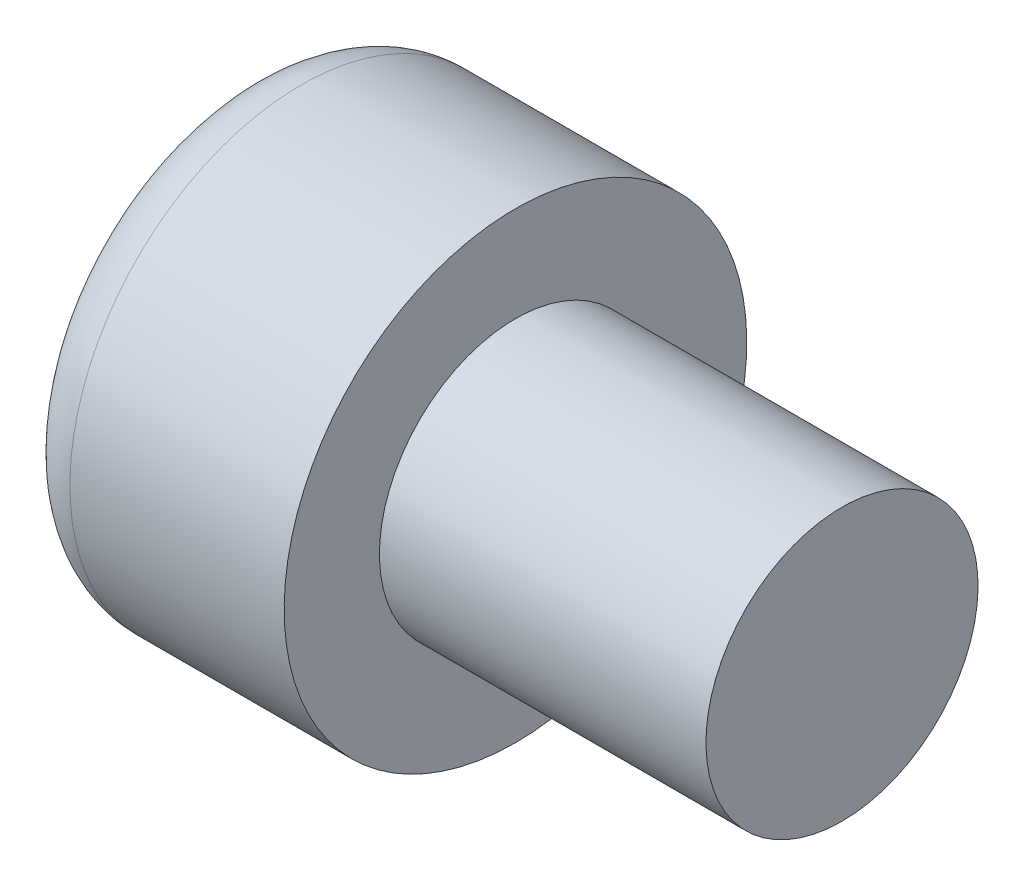
ISO-10303-21;
HEADER;
FILE_DESCRIPTION(('STEP AP214'),'2;1');
FILE_NAME('part.step','',(''),(''),'','','');
FILE_SCHEMA(('AUTOMOTIVE_DESIGN { 1 0 10303 214 1 1 1 1 }'));
ENDSEC;
DATA;
#1=APPLICATION_CONTEXT('core data for automotive mechanical design processes');
#2=APPLICATION_PROTOCOL_DEFINITION('international standard','automotive_design',2000,#1);
#3=PRODUCT_CONTEXT('',#1,'mechanical');
#4=PRODUCT('Part','Part','',(#3));
#5=PRODUCT_RELATED_PRODUCT_CATEGORY('part','',(#4));
#6=PRODUCT_DEFINITION_FORMATION('','',#4);
#7=PRODUCT_DEFINITION_CONTEXT('part definition',#1,'design');
#8=PRODUCT_DEFINITION('design','',#6,#7);
#9=PRODUCT_DEFINITION_SHAPE('','',#8);
#10=(LENGTH_UNIT() NAMED_UNIT(*) SI_UNIT(.MILLI.,.METRE.));
#11=(NAMED_UNIT(*) PLANE_ANGLE_UNIT() SI_UNIT($,.RADIAN.));
#12=(NAMED_UNIT(*) SI_UNIT($,.STERADIAN.) SOLID_ANGLE_UNIT());
#13=UNCERTAINTY_MEASURE_WITH_UNIT(LENGTH_MEASURE(1.E-05),#10,'distance_accuracy_value','');
#14=(GEOMETRIC_REPRESENTATION_CONTEXT(3) GLOBAL_UNCERTAINTY_ASSIGNED_CONTEXT((#13)) GLOBAL_UNIT_ASSIGNED_CONTEXT((#10,
#11,#12)) REPRESENTATION_CONTEXT('',''));
#15=CARTESIAN_POINT('',(0.,0.,0.));
#16=DIRECTION('',(0.,0.,1.));
#17=DIRECTION('',(1.,0.,0.));
#18=AXIS2_PLACEMENT_3D('',#15,#16,#17);
#19=CARTESIAN_POINT('',(0.,0.,0.));
#20=DIRECTION('',(1.,0.,0.));
#21=DIRECTION('',(0.,1.,0.));
#22=AXIS2_PLACEMENT_3D('',#19,#20,#21);
#23=PLANE('',#22);
#24=DIRECTION('',(0.,-0.5,-0.866025403784439));
#25=VECTOR('',#24,1.);
#26=CARTESIAN_POINT('',(0.,2.3094010767585,0.));
#27=LINE('',#26,#25);
#28=CARTESIAN_POINT('',(0.,2.3094010767585,0.));
#29=VERTEX_POINT('',#28);
#30=CARTESIAN_POINT('',(0.,1.15470053837925,-2.));
#31=VERTEX_POINT('',#30);
#32=EDGE_CURVE('E121',#29,#31,#27,.T.);
#33=ORIENTED_EDGE('',*,*,#32,.F.);
#34=DIRECTION('',(0.,0.5,-0.866025403784439));
#35=VECTOR('',#34,1.);
#36=CARTESIAN_POINT('',(0.,1.15470053837925,2.));
#37=LINE('',#36,#35);
#38=CARTESIAN_POINT('',(0.,1.15470053837925,2.));
#39=VERTEX_POINT('',#38);
#40=EDGE_CURVE('E47',#39,#29,#37,.T.);
#41=ORIENTED_EDGE('',*,*,#40,.F.);
#42=DIRECTION('',(0.,1.,0.));
#43=VECTOR('',#42,1.);
#44=CARTESIAN_POINT('',(0.,-1.15470053837925,2.));
#45=LINE('',#44,#43);
#46=CARTESIAN_POINT('',(0.,-1.15470053837925,2.));
#47=VERTEX_POINT('',#46);
#48=EDGE_CURVE('E130',#47,#39,#45,.T.);
#49=ORIENTED_EDGE('',*,*,#48,.F.);
#50=DIRECTION('',(0.,0.5,0.866025403784439));
#51=VECTOR('',#50,1.);
#52=CARTESIAN_POINT('',(0.,-2.3094010767585,0.));
#53=LINE('',#52,#51);
#54=CARTESIAN_POINT('',(0.,-2.3094010767585,0.));
#55=VERTEX_POINT('',#54);
#56=EDGE_CURVE('E128',#55,#47,#53,.T.);
#57=ORIENTED_EDGE('',*,*,#56,.F.);
#58=DIRECTION('',(0.,-0.5,0.866025403784439));
#59=VECTOR('',#58,1.);
#60=CARTESIAN_POINT('',(0.,-1.15470053837925,-2.));
#61=LINE('',#60,#59);
#62=CARTESIAN_POINT('',(0.,-1.15470053837925,-2.));
#63=VERTEX_POINT('',#62);
#64=EDGE_CURVE('E95',#63,#55,#61,.T.);
#65=ORIENTED_EDGE('',*,*,#64,.F.);
#66=DIRECTION('',(0.,-1.,0.));
#67=VECTOR('',#66,1.);
#68=CARTESIAN_POINT('',(0.,1.15470053837925,-2.));
#69=LINE('',#68,#67);
#70=EDGE_CURVE('E124',#31,#63,#69,.T.);
#71=ORIENTED_EDGE('',*,*,#70,.F.);
#72=EDGE_LOOP('',(#33,#41,#49,#57,#65,#71));
#73=FACE_BOUND('',#72,.T.);
#74=CARTESIAN_POINT('',(0.,0.,0.));
#75=DIRECTION('',(-1.,0.,0.));
#76=DIRECTION('',(0.,-1.,0.));
#77=AXIS2_PLACEMENT_3D('',#74,#75,#76);
#78=CIRCLE('',#77,3.1875);
#79=CARTESIAN_POINT('',(0.,-3.1875,0.));
#80=VERTEX_POINT('',#79);
#81=EDGE_CURVE('E11',#80,#80,#78,.T.);
#82=ORIENTED_EDGE('',*,*,#81,.T.);
#83=EDGE_LOOP('',(#82));
#84=FACE_BOUND('',#83,.T.);
#85=ADVANCED_FACE('F33',(#73,#84),#23,.F.);
#86=CARTESIAN_POINT('',(1.0625,0.,0.));
#87=DIRECTION('',(-1.,0.,0.));
#88=DIRECTION('',(0.,-1.,0.));
#89=AXIS2_PLACEMENT_3D('',#86,#87,#88);
#90=TOROIDAL_SURFACE('',#89,3.1875,1.0625);
#91=ORIENTED_EDGE('',*,*,#81,.F.);
#92=EDGE_LOOP('',(#91));
#93=FACE_BOUND('',#92,.T.);
#94=CARTESIAN_POINT('',(1.0625,0.,0.));
#95=DIRECTION('',(-1.,0.,0.));
#96=DIRECTION('',(0.,-1.,0.));
#97=AXIS2_PLACEMENT_3D('',#94,#95,#96);
#98=CIRCLE('',#97,4.25);
#99=CARTESIAN_POINT('',(1.0625,-4.25,0.));
#100=VERTEX_POINT('',#99);
#101=EDGE_CURVE('E40',#100,#100,#98,.T.);
#102=ORIENTED_EDGE('',*,*,#101,.T.);
#103=EDGE_LOOP('',(#102));
#104=FACE_BOUND('',#103,.T.);
#105=ADVANCED_FACE('F150',(#93,#104),#90,.T.);
#106=CARTESIAN_POINT('',(0.,0.,0.));
#107=DIRECTION('',(-1.,0.,0.));
#108=DIRECTION('',(0.,-1.,0.));
#109=AXIS2_PLACEMENT_3D('',#106,#107,#108);
#110=CYLINDRICAL_SURFACE('',#109,4.25);
#111=ORIENTED_EDGE('',*,*,#101,.F.);
#112=EDGE_LOOP('',(#111));
#113=FACE_BOUND('',#112,.T.);
#114=CARTESIAN_POINT('',(5.,0.,0.));
#115=DIRECTION('',(-1.,0.,0.));
#116=DIRECTION('',(0.,-1.,0.));
#117=AXIS2_PLACEMENT_3D('',#114,#115,#116);
#118=CIRCLE('',#117,4.25);
#119=CARTESIAN_POINT('',(5.,-4.25,0.));
#120=VERTEX_POINT('',#119);
#121=EDGE_CURVE('E145',#120,#120,#118,.T.);
#122=ORIENTED_EDGE('',*,*,#121,.T.);
#123=EDGE_LOOP('',(#122));
#124=FACE_BOUND('',#123,.T.);
#125=ADVANCED_FACE('F152',(#113,#124),#110,.T.);
#126=CARTESIAN_POINT('',(5.,4.25,0.));
#127=DIRECTION('',(-1.,0.,0.));
#128=DIRECTION('',(0.,-1.,0.));
#129=AXIS2_PLACEMENT_3D('',#126,#127,#128);
#130=PLANE('',#129);
#131=ORIENTED_EDGE('',*,*,#121,.F.);
#132=EDGE_LOOP('',(#131));
#133=FACE_BOUND('',#132,.T.);
#134=CARTESIAN_POINT('',(5.,0.,0.));
#135=DIRECTION('',(-1.,0.,0.));
#136=DIRECTION('',(0.,-1.,0.));
#137=AXIS2_PLACEMENT_3D('',#134,#135,#136);
#138=CIRCLE('',#137,2.5);
#139=CARTESIAN_POINT('',(5.,-2.5,0.));
#140=VERTEX_POINT('',#139);
#141=EDGE_CURVE('E142',#140,#140,#138,.T.);
#142=ORIENTED_EDGE('',*,*,#141,.T.);
#143=EDGE_LOOP('',(#142));
#144=FACE_BOUND('',#143,.T.);
#145=ADVANCED_FACE('F155',(#133,#144),#130,.F.);
#146=CARTESIAN_POINT('',(0.,0.,0.));
#147=DIRECTION('',(-1.,0.,0.));
#148=DIRECTION('',(0.,-1.,0.));
#149=AXIS2_PLACEMENT_3D('',#146,#147,#148);
#150=CYLINDRICAL_SURFACE('',#149,2.5);
#151=ORIENTED_EDGE('',*,*,#141,.F.);
#152=EDGE_LOOP('',(#151));
#153=FACE_BOUND('',#152,.T.);
#154=CARTESIAN_POINT('',(11.,0.,0.));
#155=DIRECTION('',(-1.,0.,0.));
#156=DIRECTION('',(0.,-1.,0.));
#157=AXIS2_PLACEMENT_3D('',#154,#155,#156);
#158=CIRCLE('',#157,2.5);
#159=CARTESIAN_POINT('',(11.,-2.5,0.));
#160=VERTEX_POINT('',#159);
#161=EDGE_CURVE('E134',#160,#160,#158,.T.);
#162=ORIENTED_EDGE('',*,*,#161,.T.);
#163=EDGE_LOOP('',(#162));
#164=FACE_BOUND('',#163,.T.);
#165=ADVANCED_FACE('F161',(#153,#164),#150,.T.);
#166=CARTESIAN_POINT('',(11.,2.5,0.));
#167=DIRECTION('',(-1.,0.,0.));
#168=DIRECTION('',(0.,-1.,0.));
#169=AXIS2_PLACEMENT_3D('',#166,#167,#168);
#170=PLANE('',#169);
#171=ORIENTED_EDGE('',*,*,#161,.F.);
#172=EDGE_LOOP('',(#171));
#173=FACE_BOUND('',#172,.T.);
#174=ADVANCED_FACE('F167',(#173),#170,.F.);
#175=CARTESIAN_POINT('',(2.5,1.15470053837925,2.));
#176=DIRECTION('',(0.,0.866025403784439,0.5));
#177=DIRECTION('',(0.,-0.5,0.866025403784439));
#178=AXIS2_PLACEMENT_3D('',#175,#176,#177);
#179=PLANE('',#178);
#180=ORIENTED_EDGE('',*,*,#40,.T.);
#181=DIRECTION('',(-1.,0.,0.));
#182=VECTOR('',#181,1.);
#183=CARTESIAN_POINT('',(2.5,2.3094010767585,0.));
#184=LINE('',#183,#182);
#185=CARTESIAN_POINT('',(2.5,2.3094010767585,0.));
#186=VERTEX_POINT('',#185);
#187=EDGE_CURVE('E77',#186,#29,#184,.T.);
#188=ORIENTED_EDGE('',*,*,#187,.F.);
#189=DIRECTION('',(0.,0.5,-0.866025403784439));
#190=VECTOR('',#189,1.);
#191=CARTESIAN_POINT('',(2.5,1.15470053837925,2.));
#192=LINE('',#191,#190);
#193=CARTESIAN_POINT('',(2.5,1.15470053837925,2.));
#194=VERTEX_POINT('',#193);
#195=EDGE_CURVE('E132',#194,#186,#192,.T.);
#196=ORIENTED_EDGE('',*,*,#195,.F.);
#197=DIRECTION('',(-1.,0.,0.));
#198=VECTOR('',#197,1.);
#199=CARTESIAN_POINT('',(2.5,1.15470053837925,2.));
#200=LINE('',#199,#198);
#201=EDGE_CURVE('E55',#194,#39,#200,.T.);
#202=ORIENTED_EDGE('',*,*,#201,.T.);
#203=EDGE_LOOP('',(#180,#188,#196,#202));
#204=FACE_BOUND('',#203,.T.);
#205=ADVANCED_FACE('F172',(#204),#179,.F.);
#206=CARTESIAN_POINT('',(2.5,-1.15470053837925,2.));
#207=DIRECTION('',(0.,0.,1.));
#208=DIRECTION('',(1.,0.,0.));
#209=AXIS2_PLACEMENT_3D('',#206,#207,#208);
#210=PLANE('',#209);
#211=ORIENTED_EDGE('',*,*,#48,.T.);
#212=ORIENTED_EDGE('',*,*,#201,.F.);
#213=DIRECTION('',(0.,1.,0.));
#214=VECTOR('',#213,1.);
#215=CARTESIAN_POINT('',(2.5,-1.15470053837925,2.));
#216=LINE('',#215,#214);
#217=CARTESIAN_POINT('',(2.5,-1.15470053837925,2.));
#218=VERTEX_POINT('',#217);
#219=EDGE_CURVE('E107',#218,#194,#216,.T.);
#220=ORIENTED_EDGE('',*,*,#219,.F.);
#221=DIRECTION('',(-1.,0.,0.));
#222=VECTOR('',#221,1.);
#223=CARTESIAN_POINT('',(2.5,-1.15470053837925,2.));
#224=LINE('',#223,#222);
#225=EDGE_CURVE('E99',#218,#47,#224,.T.);
#226=ORIENTED_EDGE('',*,*,#225,.T.);
#227=EDGE_LOOP('',(#211,#212,#220,#226));
#228=FACE_BOUND('',#227,.T.);
#229=ADVANCED_FACE('F177',(#228),#210,.F.);
#230=CARTESIAN_POINT('',(2.5,-2.3094010767585,0.));
#231=DIRECTION('',(0.,-0.866025403784439,0.5));
#232=DIRECTION('',(0.,-0.5,-0.866025403784439));
#233=AXIS2_PLACEMENT_3D('',#230,#231,#232);
#234=PLANE('',#233);
#235=ORIENTED_EDGE('',*,*,#56,.T.);
#236=ORIENTED_EDGE('',*,*,#225,.F.);
#237=DIRECTION('',(0.,0.5,0.866025403784439));
#238=VECTOR('',#237,1.);
#239=CARTESIAN_POINT('',(2.5,-2.3094010767585,0.));
#240=LINE('',#239,#238);
#241=CARTESIAN_POINT('',(2.5,-2.3094010767585,0.));
#242=VERTEX_POINT('',#241);
#243=EDGE_CURVE('E103',#242,#218,#240,.T.);
#244=ORIENTED_EDGE('',*,*,#243,.F.);
#245=DIRECTION('',(-1.,0.,0.));
#246=VECTOR('',#245,1.);
#247=CARTESIAN_POINT('',(2.5,-2.3094010767585,0.));
#248=LINE('',#247,#246);
#249=EDGE_CURVE('E88',#242,#55,#248,.T.);
#250=ORIENTED_EDGE('',*,*,#249,.T.);
#251=EDGE_LOOP('',(#235,#236,#244,#250));
#252=FACE_BOUND('',#251,.T.);
#253=ADVANCED_FACE('F104',(#252),#234,.F.);
#254=CARTESIAN_POINT('',(2.5,-1.15470053837925,-2.));
#255=DIRECTION('',(0.,-0.866025403784438,-0.5));
#256=DIRECTION('',(0.,0.5,-0.866025403784438));
#257=AXIS2_PLACEMENT_3D('',#254,#255,#256);
#258=PLANE('',#257);
#259=ORIENTED_EDGE('',*,*,#64,.T.);
#260=ORIENTED_EDGE('',*,*,#249,.F.);
#261=DIRECTION('',(0.,-0.5,0.866025403784439));
#262=VECTOR('',#261,1.);
#263=CARTESIAN_POINT('',(2.5,-1.15470053837925,-2.));
#264=LINE('',#263,#262);
#265=CARTESIAN_POINT('',(2.5,-1.15470053837925,-2.));
#266=VERTEX_POINT('',#265);
#267=EDGE_CURVE('E92',#266,#242,#264,.T.);
#268=ORIENTED_EDGE('',*,*,#267,.F.);
#269=DIRECTION('',(-1.,0.,0.));
#270=VECTOR('',#269,1.);
#271=CARTESIAN_POINT('',(2.5,-1.15470053837925,-2.));
#272=LINE('',#271,#270);
#273=EDGE_CURVE('E100',#266,#63,#272,.T.);
#274=ORIENTED_EDGE('',*,*,#273,.T.);
#275=EDGE_LOOP('',(#259,#260,#268,#274));
#276=FACE_BOUND('',#275,.T.);
#277=ADVANCED_FACE('F90',(#276),#258,.F.);
#278=CARTESIAN_POINT('',(2.5,1.15470053837925,-2.));
#279=DIRECTION('',(0.,0.,-1.));
#280=DIRECTION('',(-1.,0.,0.));
#281=AXIS2_PLACEMENT_3D('',#278,#279,#280);
#282=PLANE('',#281);
#283=ORIENTED_EDGE('',*,*,#70,.T.);
#284=ORIENTED_EDGE('',*,*,#273,.F.);
#285=DIRECTION('',(0.,-1.,0.));
#286=VECTOR('',#285,1.);
#287=CARTESIAN_POINT('',(2.5,1.15470053837925,-2.));
#288=LINE('',#287,#286);
#289=CARTESIAN_POINT('',(2.5,1.15470053837925,-2.));
#290=VERTEX_POINT('',#289);
#291=EDGE_CURVE('E113',#290,#266,#288,.T.);
#292=ORIENTED_EDGE('',*,*,#291,.F.);
#293=DIRECTION('',(-1.,0.,0.));
#294=VECTOR('',#293,1.);
#295=CARTESIAN_POINT('',(2.5,1.15470053837925,-2.));
#296=LINE('',#295,#294);
#297=EDGE_CURVE('E137',#290,#31,#296,.T.);
#298=ORIENTED_EDGE('',*,*,#297,.T.);
#299=EDGE_LOOP('',(#283,#284,#292,#298));
#300=FACE_BOUND('',#299,.T.);
#301=ADVANCED_FACE('F203',(#300),#282,.F.);
#302=CARTESIAN_POINT('',(2.5,2.3094010767585,0.));
#303=DIRECTION('',(0.,0.866025403784439,-0.5));
#304=DIRECTION('',(0.,0.5,0.866025403784439));
#305=AXIS2_PLACEMENT_3D('',#302,#303,#304);
#306=PLANE('',#305);
#307=ORIENTED_EDGE('',*,*,#32,.T.);
#308=ORIENTED_EDGE('',*,*,#297,.F.);
#309=DIRECTION('',(0.,-0.5,-0.866025403784439));
#310=VECTOR('',#309,1.);
#311=CARTESIAN_POINT('',(2.5,2.3094010767585,0.));
#312=LINE('',#311,#310);
#313=EDGE_CURVE('E115',#186,#290,#312,.T.);
#314=ORIENTED_EDGE('',*,*,#313,.F.);
#315=ORIENTED_EDGE('',*,*,#187,.T.);
#316=EDGE_LOOP('',(#307,#308,#314,#315));
#317=FACE_BOUND('',#316,.T.);
#318=ADVANCED_FACE('F191',(#317),#306,.F.);
#319=CARTESIAN_POINT('',(2.5,0.,0.));
#320=DIRECTION('',(-1.,0.,0.));
#321=DIRECTION('',(0.,-1.,0.));
#322=AXIS2_PLACEMENT_3D('',#319,#320,#321);
#323=PLANE('',#322);
#324=ORIENTED_EDGE('',*,*,#195,.T.);
#325=ORIENTED_EDGE('',*,*,#313,.T.);
#326=ORIENTED_EDGE('',*,*,#291,.T.);
#327=ORIENTED_EDGE('',*,*,#267,.T.);
#328=ORIENTED_EDGE('',*,*,#243,.T.);
#329=ORIENTED_EDGE('',*,*,#219,.T.);
#330=EDGE_LOOP('',(#324,#325,#326,#327,#328,#329));
#331=FACE_BOUND('',#330,.T.);
#332=ADVANCED_FACE('F110',(#331),#323,.T.);
#333=CLOSED_SHELL('',(#85,#105,#125,#145,#165,#174,#205,#229,#253,#277,#301,#318,#332));
#334=MANIFOLD_SOLID_BREP('B2',#333);
#335=ADVANCED_BREP_SHAPE_REPRESENTATION('',(#18,#334),#14);
#336=SHAPE_DEFINITION_REPRESENTATION(#9,#335);
ENDSEC;
END-ISO-10303-21;
